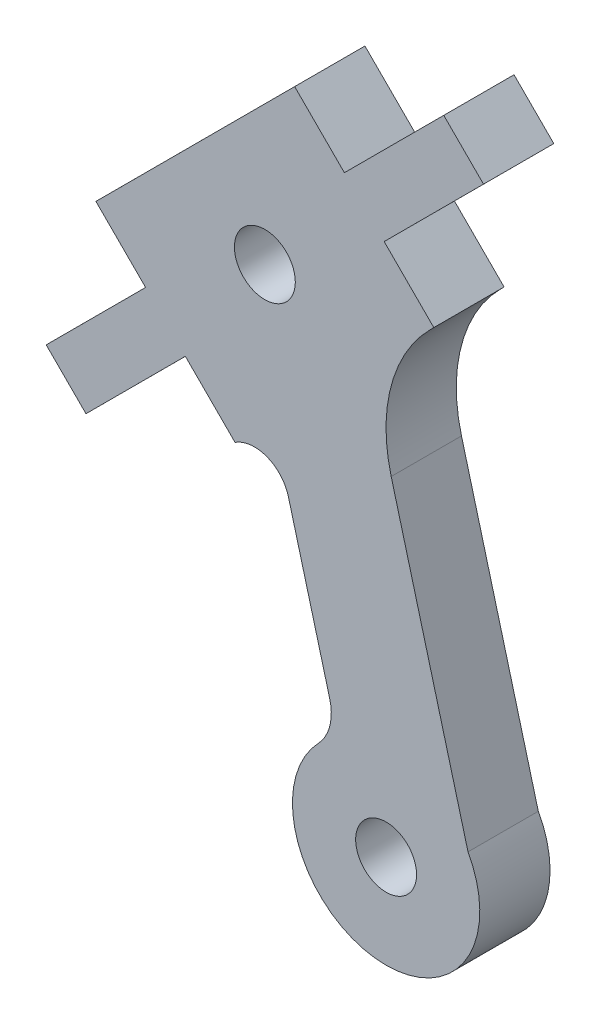
ISO-10303-21;
HEADER;
FILE_DESCRIPTION(('STEP AP214'),'2;1');
FILE_NAME('part.step','',(''),(''),'','','');
FILE_SCHEMA(('AUTOMOTIVE_DESIGN { 1 0 10303 214 1 1 1 1 }'));
ENDSEC;
DATA;
#1=APPLICATION_CONTEXT('core data for automotive mechanical design processes');
#2=APPLICATION_PROTOCOL_DEFINITION('international standard','automotive_design',2000,#1);
#3=PRODUCT_CONTEXT('',#1,'mechanical');
#4=PRODUCT('Part','Part','',(#3));
#5=PRODUCT_RELATED_PRODUCT_CATEGORY('part','',(#4));
#6=PRODUCT_DEFINITION_FORMATION('','',#4);
#7=PRODUCT_DEFINITION_CONTEXT('part definition',#1,'design');
#8=PRODUCT_DEFINITION('design','',#6,#7);
#9=PRODUCT_DEFINITION_SHAPE('','',#8);
#10=(LENGTH_UNIT() NAMED_UNIT(*) SI_UNIT(.MILLI.,.METRE.));
#11=(NAMED_UNIT(*) PLANE_ANGLE_UNIT() SI_UNIT($,.RADIAN.));
#12=(NAMED_UNIT(*) SI_UNIT($,.STERADIAN.) SOLID_ANGLE_UNIT());
#13=UNCERTAINTY_MEASURE_WITH_UNIT(LENGTH_MEASURE(1.E-05),#10,'distance_accuracy_value','');
#14=(GEOMETRIC_REPRESENTATION_CONTEXT(3) GLOBAL_UNCERTAINTY_ASSIGNED_CONTEXT((#13)) GLOBAL_UNIT_ASSIGNED_CONTEXT((#10,
#11,#12)) REPRESENTATION_CONTEXT('',''));
#15=CARTESIAN_POINT('',(0.,0.,0.));
#16=DIRECTION('',(0.,0.,1.));
#17=DIRECTION('',(1.,0.,0.));
#18=AXIS2_PLACEMENT_3D('',#15,#16,#17);
#19=CARTESIAN_POINT('',(15.2079500627444,19.1357173483696,-0.362857667475149));
#20=DIRECTION('',(0.,0.,-1.));
#21=DIRECTION('',(-1.,0.,0.));
#22=AXIS2_PLACEMENT_3D('',#19,#20,#21);
#23=CYLINDRICAL_SURFACE('',#22,6.50000000000002);
#24=CARTESIAN_POINT('',(15.2079500627444,19.1357173483696,-3.36285766747514));
#25=DIRECTION('',(0.,0.,1.));
#26=DIRECTION('',(1.,0.,0.));
#27=AXIS2_PLACEMENT_3D('',#24,#25,#26);
#28=CIRCLE('',#27,6.50000000000002);
#29=CARTESIAN_POINT('',(10.61109831095,23.7312536578797,-3.36285766747514));
#30=VERTEX_POINT('',#29);
#31=CARTESIAN_POINT('',(8.92945698730216,17.4533010201012,-3.36285766747514));
#32=VERTEX_POINT('',#31);
#33=EDGE_CURVE('E194',#30,#32,#28,.T.);
#34=ORIENTED_EDGE('',*,*,#33,.F.);
#35=DIRECTION('',(0.,0.,-1.));
#36=VECTOR('',#35,1.);
#37=CARTESIAN_POINT('',(10.61109831095,23.7312536578797,-0.362857667475149));
#38=LINE('',#37,#36);
#39=CARTESIAN_POINT('',(10.61109831095,23.7312536578797,-0.362857667475149));
#40=VERTEX_POINT('',#39);
#41=EDGE_CURVE('E11',#40,#30,#38,.T.);
#42=ORIENTED_EDGE('',*,*,#41,.F.);
#43=CARTESIAN_POINT('',(15.2079500627444,19.1357173483696,-0.362857667475149));
#44=DIRECTION('',(0.,0.,1.));
#45=DIRECTION('',(1.,0.,0.));
#46=AXIS2_PLACEMENT_3D('',#43,#44,#45);
#47=CIRCLE('',#46,6.50000000000002);
#48=CARTESIAN_POINT('',(8.92945698730216,17.4533010201012,-0.362857667475149));
#49=VERTEX_POINT('',#48);
#50=EDGE_CURVE('E245',#40,#49,#47,.T.);
#51=ORIENTED_EDGE('',*,*,#50,.T.);
#52=DIRECTION('',(0.,0.,-1.));
#53=VECTOR('',#52,1.);
#54=CARTESIAN_POINT('',(8.92945698730216,17.4533010201012,-0.362857667475149));
#55=LINE('',#54,#53);
#56=EDGE_CURVE('E40',#49,#32,#55,.T.);
#57=ORIENTED_EDGE('',*,*,#56,.T.);
#58=EDGE_LOOP('',(#34,#42,#51,#57));
#59=FACE_BOUND('',#58,.T.);
#60=ADVANCED_FACE('F37',(#59),#23,.F.);
#61=CARTESIAN_POINT('',(10.7490725950828,23.8692674362511,-0.362857667475149));
#62=DIRECTION('',(0.707207961814524,-0.70700558607846,0.));
#63=DIRECTION('',(0.70700558607846,0.707207961814524,0.));
#64=AXIS2_PLACEMENT_3D('',#61,#62,#63);
#65=PLANE('',#64);
#66=DIRECTION('',(-0.70700558607846,-0.707207961814524,0.));
#67=VECTOR('',#66,1.);
#68=CARTESIAN_POINT('',(10.7490725950828,23.8692674362511,-3.36285766747514));
#69=LINE('',#68,#67);
#70=CARTESIAN_POINT('',(10.7490725950828,23.8692674362511,-3.36285766747514));
#71=VERTEX_POINT('',#70);
#72=EDGE_CURVE('E243',#71,#30,#69,.T.);
#73=ORIENTED_EDGE('',*,*,#72,.F.);
#74=DIRECTION('',(0.,0.,-1.));
#75=VECTOR('',#74,1.);
#76=CARTESIAN_POINT('',(10.7490725950828,23.8692674362511,-0.362857667475149));
#77=LINE('',#76,#75);
#78=CARTESIAN_POINT('',(10.7490725950828,23.8692674362511,-0.362857667475149));
#79=VERTEX_POINT('',#78);
#80=EDGE_CURVE('E46',#79,#71,#77,.T.);
#81=ORIENTED_EDGE('',*,*,#80,.F.);
#82=DIRECTION('',(-0.70700558607846,-0.707207961814524,0.));
#83=VECTOR('',#82,1.);
#84=CARTESIAN_POINT('',(10.7490725950828,23.8692674362511,-0.362857667475149));
#85=LINE('',#84,#83);
#86=EDGE_CURVE('E184',#79,#40,#85,.T.);
#87=ORIENTED_EDGE('',*,*,#86,.T.);
#88=ORIENTED_EDGE('',*,*,#41,.T.);
#89=EDGE_LOOP('',(#73,#81,#87,#88));
#90=FACE_BOUND('',#89,.T.);
#91=ADVANCED_FACE('F277',(#90),#65,.T.);
#92=CARTESIAN_POINT('',(8.62908040068236,25.9886529703706,-0.362857667475149));
#93=DIRECTION('',(0.70700558607846,0.707207961814524,0.));
#94=DIRECTION('',(-0.707207961814524,0.70700558607846,0.));
#95=AXIS2_PLACEMENT_3D('',#92,#93,#94);
#96=PLANE('',#95);
#97=DIRECTION('',(0.707207961814524,-0.70700558607846,0.));
#98=VECTOR('',#97,1.);
#99=CARTESIAN_POINT('',(8.62908040068236,25.9886529703706,-3.36285766747514));
#100=LINE('',#99,#98);
#101=CARTESIAN_POINT('',(8.62908040068236,25.9886529703706,-3.36285766747514));
#102=VERTEX_POINT('',#101);
#103=EDGE_CURVE('E171',#102,#71,#100,.T.);
#104=ORIENTED_EDGE('',*,*,#103,.F.);
#105=DIRECTION('',(0.,0.,-1.));
#106=VECTOR('',#105,1.);
#107=CARTESIAN_POINT('',(8.62908040068236,25.9886529703706,-0.362857667475149));
#108=LINE('',#107,#106);
#109=CARTESIAN_POINT('',(8.62908040068236,25.9886529703706,-0.362857667475149));
#110=VERTEX_POINT('',#109);
#111=EDGE_CURVE('E166',#110,#102,#108,.T.);
#112=ORIENTED_EDGE('',*,*,#111,.F.);
#113=DIRECTION('',(0.707207961814524,-0.70700558607846,0.));
#114=VECTOR('',#113,1.);
#115=CARTESIAN_POINT('',(8.62908040068236,25.9886529703706,-0.362857667475149));
#116=LINE('',#115,#114);
#117=EDGE_CURVE('E169',#110,#79,#116,.T.);
#118=ORIENTED_EDGE('',*,*,#117,.T.);
#119=ORIENTED_EDGE('',*,*,#80,.T.);
#120=EDGE_LOOP('',(#104,#112,#118,#119));
#121=FACE_BOUND('',#120,.T.);
#122=ADVANCED_FACE('F168',(#121),#96,.T.);
#123=CARTESIAN_POINT('',(12.8704287908276,30.2312154188193,-0.362857667475149));
#124=DIRECTION('',(0.707207961814524,-0.70700558607846,0.));
#125=DIRECTION('',(0.70700558607846,0.707207961814524,0.));
#126=AXIS2_PLACEMENT_3D('',#123,#124,#125);
#127=PLANE('',#126);
#128=DIRECTION('',(-0.70700558607846,-0.707207961814524,0.));
#129=VECTOR('',#128,1.);
#130=CARTESIAN_POINT('',(12.8704287908276,30.2312154188193,-3.36285766747514));
#131=LINE('',#130,#129);
#132=CARTESIAN_POINT('',(12.8704287908276,30.2312154188193,-3.36285766747514));
#133=VERTEX_POINT('',#132);
#134=EDGE_CURVE('E240',#133,#102,#131,.T.);
#135=ORIENTED_EDGE('',*,*,#134,.F.);
#136=DIRECTION('',(0.,0.,-1.));
#137=VECTOR('',#136,1.);
#138=CARTESIAN_POINT('',(12.8704287908276,30.2312154188193,-0.362857667475149));
#139=LINE('',#138,#137);
#140=CARTESIAN_POINT('',(12.8704287908276,30.2312154188193,-0.362857667475149));
#141=VERTEX_POINT('',#140);
#142=EDGE_CURVE('E176',#141,#133,#139,.T.);
#143=ORIENTED_EDGE('',*,*,#142,.F.);
#144=DIRECTION('',(-0.70700558607846,-0.707207961814524,0.));
#145=VECTOR('',#144,1.);
#146=CARTESIAN_POINT('',(12.8704287908276,30.2312154188193,-0.362857667475149));
#147=LINE('',#146,#145);
#148=EDGE_CURVE('E182',#141,#110,#147,.T.);
#149=ORIENTED_EDGE('',*,*,#148,.T.);
#150=ORIENTED_EDGE('',*,*,#111,.T.);
#151=EDGE_LOOP('',(#135,#143,#149,#150));
#152=FACE_BOUND('',#151,.T.);
#153=ADVANCED_FACE('F186',(#152),#127,.T.);
#154=CARTESIAN_POINT('',(11.1732462274371,31.927912313794,-0.362857667475149));
#155=DIRECTION('',(0.707005586078461,0.707207961814523,0.));
#156=DIRECTION('',(-0.707207961814523,0.707005586078461,0.));
#157=AXIS2_PLACEMENT_3D('',#154,#155,#156);
#158=PLANE('',#157);
#159=DIRECTION('',(0.707207961814523,-0.707005586078461,0.));
#160=VECTOR('',#159,1.);
#161=CARTESIAN_POINT('',(11.1732462274371,31.927912313794,-3.36285766747514));
#162=LINE('',#161,#160);
#163=CARTESIAN_POINT('',(11.1732462274371,31.927912313794,-3.36285766747514));
#164=VERTEX_POINT('',#163);
#165=EDGE_CURVE('E237',#164,#133,#162,.T.);
#166=ORIENTED_EDGE('',*,*,#165,.F.);
#167=DIRECTION('',(0.,0.,-1.));
#168=VECTOR('',#167,1.);
#169=CARTESIAN_POINT('',(11.1732462274371,31.927912313794,-0.362857667475149));
#170=LINE('',#169,#168);
#171=CARTESIAN_POINT('',(11.1732462274371,31.927912313794,-0.362857667475149));
#172=VERTEX_POINT('',#171);
#173=EDGE_CURVE('E249',#172,#164,#170,.T.);
#174=ORIENTED_EDGE('',*,*,#173,.F.);
#175=DIRECTION('',(0.707207961814523,-0.707005586078461,0.));
#176=VECTOR('',#175,1.);
#177=CARTESIAN_POINT('',(11.1732462274371,31.927912313794,-0.362857667475149));
#178=LINE('',#177,#176);
#179=EDGE_CURVE('E187',#172,#141,#178,.T.);
#180=ORIENTED_EDGE('',*,*,#179,.T.);
#181=ORIENTED_EDGE('',*,*,#142,.T.);
#182=EDGE_LOOP('',(#166,#174,#180,#181));
#183=FACE_BOUND('',#182,.T.);
#184=ADVANCED_FACE('F290',(#183),#158,.T.);
#185=CARTESIAN_POINT('',(6.93196836559366,27.6854204138355,-0.362857667475149));
#186=DIRECTION('',(-0.707207961814524,0.70700558607846,0.));
#187=DIRECTION('',(-0.70700558607846,-0.707207961814524,0.));
#188=AXIS2_PLACEMENT_3D('',#185,#186,#187);
#189=PLANE('',#188);
#190=DIRECTION('',(0.70700558607846,0.707207961814524,0.));
#191=VECTOR('',#190,1.);
#192=CARTESIAN_POINT('',(6.93196836559366,27.6854204138355,-3.36285766747514));
#193=LINE('',#192,#191);
#194=CARTESIAN_POINT('',(6.93196836559366,27.6854204138355,-3.36285766747514));
#195=VERTEX_POINT('',#194);
#196=EDGE_CURVE('E234',#195,#164,#193,.T.);
#197=ORIENTED_EDGE('',*,*,#196,.F.);
#198=DIRECTION('',(0.,0.,-1.));
#199=VECTOR('',#198,1.);
#200=CARTESIAN_POINT('',(6.93196836559366,27.6854204138355,-0.362857667475149));
#201=LINE('',#200,#199);
#202=CARTESIAN_POINT('',(6.93196836559366,27.6854204138355,-0.362857667475149));
#203=VERTEX_POINT('',#202);
#204=EDGE_CURVE('E251',#203,#195,#201,.T.);
#205=ORIENTED_EDGE('',*,*,#204,.F.);
#206=DIRECTION('',(0.70700558607846,0.707207961814524,0.));
#207=VECTOR('',#206,1.);
#208=CARTESIAN_POINT('',(6.93196836559366,27.6854204138355,-0.362857667475149));
#209=LINE('',#208,#207);
#210=EDGE_CURVE('E189',#203,#172,#209,.T.);
#211=ORIENTED_EDGE('',*,*,#210,.T.);
#212=ORIENTED_EDGE('',*,*,#173,.T.);
#213=EDGE_LOOP('',(#197,#205,#211,#212));
#214=FACE_BOUND('',#213,.T.);
#215=ADVANCED_FACE('F293',(#214),#189,.T.);
#216=CARTESIAN_POINT('',(4.80844312338461,29.8083379847411,-0.362857667475149));
#217=DIRECTION('',(0.70700558607846,0.707207961814524,0.));
#218=DIRECTION('',(-0.707207961814524,0.70700558607846,0.));
#219=AXIS2_PLACEMENT_3D('',#216,#217,#218);
#220=PLANE('',#219);
#221=DIRECTION('',(0.707207961814524,-0.70700558607846,0.));
#222=VECTOR('',#221,1.);
#223=CARTESIAN_POINT('',(4.80844312338461,29.8083379847411,-3.36285766747514));
#224=LINE('',#223,#222);
#225=CARTESIAN_POINT('',(4.80844312338461,29.8083379847411,-3.36285766747514));
#226=VERTEX_POINT('',#225);
#227=EDGE_CURVE('E231',#226,#195,#224,.T.);
#228=ORIENTED_EDGE('',*,*,#227,.F.);
#229=DIRECTION('',(0.,0.,-1.));
#230=VECTOR('',#229,1.);
#231=CARTESIAN_POINT('',(4.80844312338461,29.8083379847411,-0.362857667475149));
#232=LINE('',#231,#230);
#233=CARTESIAN_POINT('',(4.80844312338461,29.8083379847411,-0.362857667475149));
#234=VERTEX_POINT('',#233);
#235=EDGE_CURVE('E253',#234,#226,#232,.T.);
#236=ORIENTED_EDGE('',*,*,#235,.F.);
#237=DIRECTION('',(0.707207961814524,-0.70700558607846,0.));
#238=VECTOR('',#237,1.);
#239=CARTESIAN_POINT('',(4.80844312338461,29.8083379847411,-0.362857667475149));
#240=LINE('',#239,#238);
#241=EDGE_CURVE('E409',#234,#203,#240,.T.);
#242=ORIENTED_EDGE('',*,*,#241,.T.);
#243=ORIENTED_EDGE('',*,*,#204,.T.);
#244=EDGE_LOOP('',(#228,#236,#242,#243));
#245=FACE_BOUND('',#244,.T.);
#246=ADVANCED_FACE('F297',(#245),#220,.T.);
#247=CARTESIAN_POINT('',(-3.67577876488751,21.3216875433099,-0.362857667475149));
#248=DIRECTION('',(-0.707207961814524,0.70700558607846,0.));
#249=DIRECTION('',(-0.70700558607846,-0.707207961814524,0.));
#250=AXIS2_PLACEMENT_3D('',#247,#248,#249);
#251=PLANE('',#250);
#252=DIRECTION('',(0.70700558607846,0.707207961814524,0.));
#253=VECTOR('',#252,1.);
#254=CARTESIAN_POINT('',(-3.67577876488751,21.3216875433099,-3.36285766747514));
#255=LINE('',#254,#253);
#256=CARTESIAN_POINT('',(-3.67577876488751,21.3216875433099,-3.36285766747514));
#257=VERTEX_POINT('',#256);
#258=EDGE_CURVE('E228',#257,#226,#255,.T.);
#259=ORIENTED_EDGE('',*,*,#258,.F.);
#260=DIRECTION('',(0.,0.,-1.));
#261=VECTOR('',#260,1.);
#262=CARTESIAN_POINT('',(-3.67577876488751,21.3216875433099,-0.362857667475149));
#263=LINE('',#262,#261);
#264=CARTESIAN_POINT('',(-3.67577876488751,21.3216875433099,-0.362857667475149));
#265=VERTEX_POINT('',#264);
#266=EDGE_CURVE('E255',#265,#257,#263,.T.);
#267=ORIENTED_EDGE('',*,*,#266,.F.);
#268=DIRECTION('',(0.70700558607846,0.707207961814524,0.));
#269=VECTOR('',#268,1.);
#270=CARTESIAN_POINT('',(-3.67577876488751,21.3216875433099,-0.362857667475149));
#271=LINE('',#270,#269);
#272=EDGE_CURVE('E406',#265,#234,#271,.T.);
#273=ORIENTED_EDGE('',*,*,#272,.T.);
#274=ORIENTED_EDGE('',*,*,#235,.T.);
#275=EDGE_LOOP('',(#259,#267,#273,#274));
#276=FACE_BOUND('',#275,.T.);
#277=ADVANCED_FACE('F301',(#276),#251,.T.);
#278=CARTESIAN_POINT('',(-1.55453239865851,19.2010481962576,-0.362857667475149));
#279=DIRECTION('',(-0.707005586078461,-0.707207961814523,0.));
#280=DIRECTION('',(0.707207961814523,-0.707005586078461,0.));
#281=AXIS2_PLACEMENT_3D('',#278,#279,#280);
#282=PLANE('',#281);
#283=DIRECTION('',(-0.707207961814523,0.707005586078461,0.));
#284=VECTOR('',#283,1.);
#285=CARTESIAN_POINT('',(-1.55453239865851,19.2010481962576,-3.36285766747514));
#286=LINE('',#285,#284);
#287=CARTESIAN_POINT('',(-1.55453239865851,19.2010481962576,-3.36285766747514));
#288=VERTEX_POINT('',#287);
#289=EDGE_CURVE('E225',#288,#257,#286,.T.);
#290=ORIENTED_EDGE('',*,*,#289,.F.);
#291=DIRECTION('',(0.,0.,-1.));
#292=VECTOR('',#291,1.);
#293=CARTESIAN_POINT('',(-1.55453239865851,19.2010481962576,-0.362857667475149));
#294=LINE('',#293,#292);
#295=CARTESIAN_POINT('',(-1.55453239865851,19.2010481962576,-0.362857667475149));
#296=VERTEX_POINT('',#295);
#297=EDGE_CURVE('E257',#296,#288,#294,.T.);
#298=ORIENTED_EDGE('',*,*,#297,.F.);
#299=DIRECTION('',(-0.707207961814523,0.707005586078461,0.));
#300=VECTOR('',#299,1.);
#301=CARTESIAN_POINT('',(-1.55453239865851,19.2010481962576,-0.362857667475149));
#302=LINE('',#301,#300);
#303=EDGE_CURVE('E403',#296,#265,#302,.T.);
#304=ORIENTED_EDGE('',*,*,#303,.T.);
#305=ORIENTED_EDGE('',*,*,#266,.T.);
#306=EDGE_LOOP('',(#290,#298,#304,#305));
#307=FACE_BOUND('',#306,.T.);
#308=ADVANCED_FACE('F305',(#307),#282,.T.);
#309=CARTESIAN_POINT('',(-5.79750925647129,14.9568568140031,-0.362857667475149));
#310=DIRECTION('',(-0.707207961814524,0.70700558607846,0.));
#311=DIRECTION('',(-0.70700558607846,-0.707207961814524,0.));
#312=AXIS2_PLACEMENT_3D('',#309,#310,#311);
#313=PLANE('',#312);
#314=DIRECTION('',(0.70700558607846,0.707207961814524,0.));
#315=VECTOR('',#314,1.);
#316=CARTESIAN_POINT('',(-5.79750925647129,14.9568568140031,-3.36285766747514));
#317=LINE('',#316,#315);
#318=CARTESIAN_POINT('',(-5.79750925647129,14.9568568140031,-3.36285766747514));
#319=VERTEX_POINT('',#318);
#320=EDGE_CURVE('E222',#319,#288,#317,.T.);
#321=ORIENTED_EDGE('',*,*,#320,.F.);
#322=DIRECTION('',(0.,0.,-1.));
#323=VECTOR('',#322,1.);
#324=CARTESIAN_POINT('',(-5.79750925647129,14.9568568140031,-0.362857667475149));
#325=LINE('',#324,#323);
#326=CARTESIAN_POINT('',(-5.79750925647129,14.9568568140031,-0.362857667475149));
#327=VERTEX_POINT('',#326);
#328=EDGE_CURVE('E259',#327,#319,#325,.T.);
#329=ORIENTED_EDGE('',*,*,#328,.F.);
#330=DIRECTION('',(0.70700558607846,0.707207961814524,0.));
#331=VECTOR('',#330,1.);
#332=CARTESIAN_POINT('',(-5.79750925647129,14.9568568140031,-0.362857667475149));
#333=LINE('',#332,#331);
#334=EDGE_CURVE('E400',#327,#296,#333,.T.);
#335=ORIENTED_EDGE('',*,*,#334,.T.);
#336=ORIENTED_EDGE('',*,*,#297,.T.);
#337=EDGE_LOOP('',(#321,#329,#335,#336));
#338=FACE_BOUND('',#337,.T.);
#339=ADVANCED_FACE('F309',(#338),#313,.T.);
#340=CARTESIAN_POINT('',(-4.09981959931593,13.2596529703744,-0.362857667475149));
#341=DIRECTION('',(-0.70700558607846,-0.707207961814524,0.));
#342=DIRECTION('',(0.707207961814524,-0.70700558607846,0.));
#343=AXIS2_PLACEMENT_3D('',#340,#341,#342);
#344=PLANE('',#343);
#345=DIRECTION('',(-0.707207961814524,0.70700558607846,0.));
#346=VECTOR('',#345,1.);
#347=CARTESIAN_POINT('',(-4.09981959931593,13.2596529703744,-3.36285766747514));
#348=LINE('',#347,#346);
#349=CARTESIAN_POINT('',(-4.09981959931593,13.2596529703744,-3.36285766747514));
#350=VERTEX_POINT('',#349);
#351=EDGE_CURVE('E219',#350,#319,#348,.T.);
#352=ORIENTED_EDGE('',*,*,#351,.F.);
#353=DIRECTION('',(0.,0.,-1.));
#354=VECTOR('',#353,1.);
#355=CARTESIAN_POINT('',(-4.09981959931593,13.2596529703744,-0.362857667475149));
#356=LINE('',#355,#354);
#357=CARTESIAN_POINT('',(-4.09981959931593,13.2596529703744,-0.362857667475149));
#358=VERTEX_POINT('',#357);
#359=EDGE_CURVE('E261',#358,#350,#356,.T.);
#360=ORIENTED_EDGE('',*,*,#359,.F.);
#361=DIRECTION('',(-0.707207961814524,0.70700558607846,0.));
#362=VECTOR('',#361,1.);
#363=CARTESIAN_POINT('',(-4.09981959931593,13.2596529703744,-0.362857667475149));
#364=LINE('',#363,#362);
#365=EDGE_CURVE('E397',#358,#327,#364,.T.);
#366=ORIENTED_EDGE('',*,*,#365,.T.);
#367=ORIENTED_EDGE('',*,*,#328,.T.);
#368=EDGE_LOOP('',(#352,#360,#366,#367));
#369=FACE_BOUND('',#368,.T.);
#370=ADVANCED_FACE('F313',(#369),#344,.T.);
#371=CARTESIAN_POINT('',(0.142530427800659,17.5032173425065,-0.362857667475149));
#372=DIRECTION('',(0.707207961814524,-0.70700558607846,0.));
#373=DIRECTION('',(0.70700558607846,0.707207961814524,0.));
#374=AXIS2_PLACEMENT_3D('',#371,#372,#373);
#375=PLANE('',#374);
#376=DIRECTION('',(-0.70700558607846,-0.707207961814524,0.));
#377=VECTOR('',#376,1.);
#378=CARTESIAN_POINT('',(0.142530427800659,17.5032173425065,-3.36285766747514));
#379=LINE('',#378,#377);
#380=CARTESIAN_POINT('',(0.142530427800659,17.5032173425065,-3.36285766747514));
#381=VERTEX_POINT('',#380);
#382=EDGE_CURVE('E216',#381,#350,#379,.T.);
#383=ORIENTED_EDGE('',*,*,#382,.F.);
#384=DIRECTION('',(0.,0.,-1.));
#385=VECTOR('',#384,1.);
#386=CARTESIAN_POINT('',(0.142530427800659,17.5032173425065,-0.362857667475149));
#387=LINE('',#386,#385);
#388=CARTESIAN_POINT('',(0.142530427800659,17.5032173425065,-0.362857667475149));
#389=VERTEX_POINT('',#388);
#390=EDGE_CURVE('E263',#389,#381,#387,.T.);
#391=ORIENTED_EDGE('',*,*,#390,.F.);
#392=DIRECTION('',(-0.70700558607846,-0.707207961814524,0.));
#393=VECTOR('',#392,1.);
#394=CARTESIAN_POINT('',(0.142530427800659,17.5032173425065,-0.362857667475149));
#395=LINE('',#394,#393);
#396=EDGE_CURVE('E394',#389,#358,#395,.T.);
#397=ORIENTED_EDGE('',*,*,#396,.T.);
#398=ORIENTED_EDGE('',*,*,#359,.T.);
#399=EDGE_LOOP('',(#383,#391,#397,#398));
#400=FACE_BOUND('',#399,.T.);
#401=ADVANCED_FACE('F317',(#400),#375,.T.);
#402=CARTESIAN_POINT('',(2.26429440442013,15.3820605331839,-0.362857667475149));
#403=DIRECTION('',(-0.707005586078461,-0.707207961814523,0.));
#404=DIRECTION('',(0.707207961814523,-0.707005586078461,0.));
#405=AXIS2_PLACEMENT_3D('',#402,#403,#404);
#406=PLANE('',#405);
#407=DIRECTION('',(-0.707207961814523,0.707005586078461,0.));
#408=VECTOR('',#407,1.);
#409=CARTESIAN_POINT('',(2.26429440442013,15.3820605331839,-3.36285766747514));
#410=LINE('',#409,#408);
#411=CARTESIAN_POINT('',(2.26429440442013,15.3820605331839,-3.36285766747514));
#412=VERTEX_POINT('',#411);
#413=EDGE_CURVE('E213',#412,#381,#410,.T.);
#414=ORIENTED_EDGE('',*,*,#413,.F.);
#415=DIRECTION('',(0.,0.,-1.));
#416=VECTOR('',#415,1.);
#417=CARTESIAN_POINT('',(2.26429440442013,15.3820605331839,-0.362857667475149));
#418=LINE('',#417,#416);
#419=CARTESIAN_POINT('',(2.26429440442013,15.3820605331839,-0.362857667475149));
#420=VERTEX_POINT('',#419);
#421=EDGE_CURVE('E265',#420,#412,#418,.T.);
#422=ORIENTED_EDGE('',*,*,#421,.F.);
#423=DIRECTION('',(-0.707207961814523,0.707005586078461,0.));
#424=VECTOR('',#423,1.);
#425=CARTESIAN_POINT('',(2.26429440442013,15.3820605331839,-0.362857667475149));
#426=LINE('',#425,#424);
#427=EDGE_CURVE('E391',#420,#389,#426,.T.);
#428=ORIENTED_EDGE('',*,*,#427,.T.);
#429=ORIENTED_EDGE('',*,*,#390,.T.);
#430=EDGE_LOOP('',(#414,#422,#428,#429));
#431=FACE_BOUND('',#430,.T.);
#432=ADVANCED_FACE('F321',(#431),#406,.T.);
#433=CARTESIAN_POINT('',(3.09080137362647,14.1303072708183,-0.362857667475149));
#434=DIRECTION('',(0.,0.,-1.));
#435=DIRECTION('',(-1.,0.,0.));
#436=AXIS2_PLACEMENT_3D('',#433,#434,#435);
#437=CYLINDRICAL_SURFACE('',#436,1.4999999999965);
#438=CARTESIAN_POINT('',(3.09080137362647,14.1303072708183,-3.36285766747514));
#439=DIRECTION('',(0.,0.,1.));
#440=DIRECTION('',(1.,0.,0.));
#441=AXIS2_PLACEMENT_3D('',#438,#439,#440);
#442=CIRCLE('',#441,1.4999999999965);
#443=CARTESIAN_POINT('',(4.53968439103283,14.5185571927255,-3.36285766747514));
#444=VERTEX_POINT('',#443);
#445=EDGE_CURVE('E210',#444,#412,#442,.T.);
#446=ORIENTED_EDGE('',*,*,#445,.F.);
#447=DIRECTION('',(0.,0.,-1.));
#448=VECTOR('',#447,1.);
#449=CARTESIAN_POINT('',(4.53968439103283,14.5185571927255,-0.362857667475149));
#450=LINE('',#449,#448);
#451=CARTESIAN_POINT('',(4.53968439103283,14.5185571927255,-0.362857667475149));
#452=VERTEX_POINT('',#451);
#453=EDGE_CURVE('E267',#452,#444,#450,.T.);
#454=ORIENTED_EDGE('',*,*,#453,.F.);
#455=CARTESIAN_POINT('',(3.09080137362647,14.1303072708183,-0.362857667475149));
#456=DIRECTION('',(0.,0.,1.));
#457=DIRECTION('',(1.,0.,0.));
#458=AXIS2_PLACEMENT_3D('',#455,#456,#457);
#459=CIRCLE('',#458,1.4999999999965);
#460=EDGE_CURVE('E388',#452,#420,#459,.T.);
#461=ORIENTED_EDGE('',*,*,#460,.T.);
#462=ORIENTED_EDGE('',*,*,#421,.T.);
#463=EDGE_LOOP('',(#446,#454,#461,#462));
#464=FACE_BOUND('',#463,.T.);
#465=ADVANCED_FACE('F325',(#464),#437,.F.);
#466=CARTESIAN_POINT('',(6.30415992830698,7.93383303353641,-0.362857667475149));
#467=DIRECTION('',(-0.965922011606496,-0.258833281272058,0.));
#468=DIRECTION('',(0.258833281272058,-0.965922011606496,0.));
#469=AXIS2_PLACEMENT_3D('',#466,#467,#468);
#470=PLANE('',#469);
#471=DIRECTION('',(-0.258833281272058,0.965922011606496,0.));
#472=VECTOR('',#471,1.);
#473=CARTESIAN_POINT('',(6.30415992830698,7.93383303353641,-3.36285766747514));
#474=LINE('',#473,#472);
#475=CARTESIAN_POINT('',(6.30415992830698,7.93383303353641,-3.36285766747514));
#476=VERTEX_POINT('',#475);
#477=EDGE_CURVE('E207',#476,#444,#474,.T.);
#478=ORIENTED_EDGE('',*,*,#477,.F.);
#479=DIRECTION('',(0.,0.,-1.));
#480=VECTOR('',#479,1.);
#481=CARTESIAN_POINT('',(6.30415992830698,7.93383303353641,-0.362857667475149));
#482=LINE('',#481,#480);
#483=CARTESIAN_POINT('',(6.30415992830698,7.93383303353641,-0.362857667475149));
#484=VERTEX_POINT('',#483);
#485=EDGE_CURVE('E269',#484,#476,#482,.T.);
#486=ORIENTED_EDGE('',*,*,#485,.F.);
#487=DIRECTION('',(-0.258833281272058,0.965922011606496,0.));
#488=VECTOR('',#487,1.);
#489=CARTESIAN_POINT('',(6.30415992830698,7.93383303353641,-0.362857667475149));
#490=LINE('',#489,#488);
#491=EDGE_CURVE('E385',#484,#452,#490,.T.);
#492=ORIENTED_EDGE('',*,*,#491,.T.);
#493=ORIENTED_EDGE('',*,*,#453,.T.);
#494=EDGE_LOOP('',(#478,#486,#492,#493));
#495=FACE_BOUND('',#494,.T.);
#496=ADVANCED_FACE('F329',(#495),#470,.T.);
#497=CARTESIAN_POINT('',(4.37231590509399,7.41616647099229,-0.362857667475149));
#498=DIRECTION('',(0.,0.,-1.));
#499=DIRECTION('',(-1.,0.,0.));
#500=AXIS2_PLACEMENT_3D('',#497,#498,#499);
#501=CYLINDRICAL_SURFACE('',#500,2.);
#502=CARTESIAN_POINT('',(4.37231590509399,7.41616647099229,-3.36285766747514));
#503=DIRECTION('',(0.,0.,1.));
#504=DIRECTION('',(1.,0.,0.));
#505=AXIS2_PLACEMENT_3D('',#502,#503,#504);
#506=CIRCLE('',#505,2.);
#507=CARTESIAN_POINT('',(5.81930803297835,6.03550946005848,-3.36285766747514));
#508=VERTEX_POINT('',#507);
#509=EDGE_CURVE('E204',#508,#476,#506,.T.);
#510=ORIENTED_EDGE('',*,*,#509,.F.);
#511=DIRECTION('',(0.,0.,-1.));
#512=VECTOR('',#511,1.);
#513=CARTESIAN_POINT('',(5.81930803297835,6.03550946005848,-0.362857667475149));
#514=LINE('',#513,#512);
#515=CARTESIAN_POINT('',(5.81930803297835,6.03550946005848,-0.362857667475149));
#516=VERTEX_POINT('',#515);
#517=EDGE_CURVE('E271',#516,#508,#514,.T.);
#518=ORIENTED_EDGE('',*,*,#517,.F.);
#519=CARTESIAN_POINT('',(4.37231590509399,7.41616647099229,-0.362857667475149));
#520=DIRECTION('',(0.,0.,1.));
#521=DIRECTION('',(1.,0.,0.));
#522=AXIS2_PLACEMENT_3D('',#519,#520,#521);
#523=CIRCLE('',#522,2.);
#524=EDGE_CURVE('E382',#516,#484,#523,.T.);
#525=ORIENTED_EDGE('',*,*,#524,.T.);
#526=ORIENTED_EDGE('',*,*,#485,.T.);
#527=EDGE_LOOP('',(#510,#518,#525,#526));
#528=FACE_BOUND('',#527,.T.);
#529=ADVANCED_FACE('F333',(#528),#501,.F.);
#530=CARTESIAN_POINT('',(8.71249984000659,3.27495155834402,-0.362857667475149));
#531=DIRECTION('',(0.,0.,-1.));
#532=DIRECTION('',(-1.,0.,0.));
#533=AXIS2_PLACEMENT_3D('',#530,#531,#532);
#534=CYLINDRICAL_SURFACE('',#533,3.99890469516009);
#535=CARTESIAN_POINT('',(8.71249984000659,3.27495155834402,-3.36285766747514));
#536=DIRECTION('',(0.,0.,-1.));
#537=DIRECTION('',(-1.,0.,0.));
#538=AXIS2_PLACEMENT_3D('',#535,#536,#537);
#539=CIRCLE('',#538,3.99890469516009);
#540=CARTESIAN_POINT('',(12.2085349080119,5.21633703378425,-3.36285766747514));
#541=VERTEX_POINT('',#540);
#542=EDGE_CURVE('E201',#541,#508,#539,.T.);
#543=ORIENTED_EDGE('',*,*,#542,.F.);
#544=DIRECTION('',(0.,0.,-1.));
#545=VECTOR('',#544,1.);
#546=CARTESIAN_POINT('',(12.2085349080119,5.21633703378425,-0.362857667475149));
#547=LINE('',#546,#545);
#548=CARTESIAN_POINT('',(12.2085349080119,5.21633703378425,-0.362857667475149));
#549=VERTEX_POINT('',#548);
#550=EDGE_CURVE('E272',#549,#541,#547,.T.);
#551=ORIENTED_EDGE('',*,*,#550,.F.);
#552=CARTESIAN_POINT('',(8.71249984000659,3.27495155834402,-0.362857667475149));
#553=DIRECTION('',(0.,0.,-1.));
#554=DIRECTION('',(-1.,0.,0.));
#555=AXIS2_PLACEMENT_3D('',#552,#553,#554);
#556=CIRCLE('',#555,3.99890469516009);
#557=EDGE_CURVE('E379',#549,#516,#556,.T.);
#558=ORIENTED_EDGE('',*,*,#557,.T.);
#559=ORIENTED_EDGE('',*,*,#517,.T.);
#560=EDGE_LOOP('',(#543,#551,#558,#559));
#561=FACE_BOUND('',#560,.T.);
#562=ADVANCED_FACE('F337',(#561),#534,.T.);
#563=CARTESIAN_POINT('',(8.92945698730216,17.4533010201012,-0.362857667475149));
#564=DIRECTION('',(0.965922011606496,0.258833281272059,0.));
#565=DIRECTION('',(-0.258833281272059,0.965922011606496,0.));
#566=AXIS2_PLACEMENT_3D('',#563,#564,#565);
#567=PLANE('',#566);
#568=DIRECTION('',(0.258833281272059,-0.965922011606496,0.));
#569=VECTOR('',#568,1.);
#570=CARTESIAN_POINT('',(8.92945698730216,17.4533010201012,-3.36285766747514));
#571=LINE('',#570,#569);
#572=EDGE_CURVE('E197',#32,#541,#571,.T.);
#573=ORIENTED_EDGE('',*,*,#572,.F.);
#574=ORIENTED_EDGE('',*,*,#56,.F.);
#575=DIRECTION('',(0.258833281272059,-0.965922011606496,0.));
#576=VECTOR('',#575,1.);
#577=CARTESIAN_POINT('',(8.92945698730216,17.4533010201012,-0.362857667475149));
#578=LINE('',#577,#576);
#579=EDGE_CURVE('E377',#49,#549,#578,.T.);
#580=ORIENTED_EDGE('',*,*,#579,.T.);
#581=ORIENTED_EDGE('',*,*,#550,.T.);
#582=EDGE_LOOP('',(#573,#574,#580,#581));
#583=FACE_BOUND('',#582,.T.);
#584=ADVANCED_FACE('F274',(#583),#567,.T.);
#585=CARTESIAN_POINT('',(15.2079500627444,19.1357173483696,-0.362857667475149));
#586=DIRECTION('',(0.,0.,1.));
#587=DIRECTION('',(1.,0.,0.));
#588=AXIS2_PLACEMENT_3D('',#585,#586,#587);
#589=PLANE('',#588);
#590=CARTESIAN_POINT('',(8.71249984000659,3.27495155834402,-0.362857667475149));
#591=DIRECTION('',(0.,0.,-1.));
#592=DIRECTION('',(1.,0.,0.));
#593=AXIS2_PLACEMENT_3D('',#590,#591,#592);
#594=CIRCLE('',#593,1.3);
#595=CARTESIAN_POINT('',(10.0124998400066,3.27495155834402,-0.362857667475149));
#596=VERTEX_POINT('',#595);
#597=EDGE_CURVE('E364',#596,#596,#594,.T.);
#598=ORIENTED_EDGE('',*,*,#597,.T.);
#599=EDGE_LOOP('',(#598));
#600=FACE_BOUND('',#599,.T.);
#601=CARTESIAN_POINT('',(3.53656757422475,22.5939838241258,-0.362857667475149));
#602=DIRECTION('',(0.,0.,-1.));
#603=DIRECTION('',(1.,0.,0.));
#604=AXIS2_PLACEMENT_3D('',#601,#602,#603);
#605=CIRCLE('',#604,1.3);
#606=CARTESIAN_POINT('',(4.83656757422475,22.5939838241258,-0.362857667475149));
#607=VERTEX_POINT('',#606);
#608=EDGE_CURVE('E198',#607,#607,#605,.T.);
#609=ORIENTED_EDGE('',*,*,#608,.T.);
#610=EDGE_LOOP('',(#609));
#611=FACE_BOUND('',#610,.T.);
#612=ORIENTED_EDGE('',*,*,#50,.F.);
#613=ORIENTED_EDGE('',*,*,#86,.F.);
#614=ORIENTED_EDGE('',*,*,#117,.F.);
#615=ORIENTED_EDGE('',*,*,#148,.F.);
#616=ORIENTED_EDGE('',*,*,#179,.F.);
#617=ORIENTED_EDGE('',*,*,#210,.F.);
#618=ORIENTED_EDGE('',*,*,#241,.F.);
#619=ORIENTED_EDGE('',*,*,#272,.F.);
#620=ORIENTED_EDGE('',*,*,#303,.F.);
#621=ORIENTED_EDGE('',*,*,#334,.F.);
#622=ORIENTED_EDGE('',*,*,#365,.F.);
#623=ORIENTED_EDGE('',*,*,#396,.F.);
#624=ORIENTED_EDGE('',*,*,#427,.F.);
#625=ORIENTED_EDGE('',*,*,#460,.F.);
#626=ORIENTED_EDGE('',*,*,#491,.F.);
#627=ORIENTED_EDGE('',*,*,#524,.F.);
#628=ORIENTED_EDGE('',*,*,#557,.F.);
#629=ORIENTED_EDGE('',*,*,#579,.F.);
#630=EDGE_LOOP('',(#612,#613,#614,#615,#616,#617,#618,#619,#620,#621,#622,#623,#624,#625,#626,
#627,#628,#629));
#631=FACE_BOUND('',#630,.T.);
#632=ADVANCED_FACE('F180',(#600,#611,#631),#589,.T.);
#633=CARTESIAN_POINT('',(15.2079500627444,19.1357173483696,-3.36285766747514));
#634=DIRECTION('',(0.,0.,1.));
#635=DIRECTION('',(1.,0.,0.));
#636=AXIS2_PLACEMENT_3D('',#633,#634,#635);
#637=PLANE('',#636);
#638=CARTESIAN_POINT('',(8.71249984000659,3.27495155834402,-3.36285766747514));
#639=DIRECTION('',(0.,0.,-1.));
#640=DIRECTION('',(1.,0.,0.));
#641=AXIS2_PLACEMENT_3D('',#638,#639,#640);
#642=CIRCLE('',#641,1.3);
#643=CARTESIAN_POINT('',(10.0124998400066,3.27495155834402,-3.36285766747514));
#644=VERTEX_POINT('',#643);
#645=EDGE_CURVE('E367',#644,#644,#642,.T.);
#646=ORIENTED_EDGE('',*,*,#645,.F.);
#647=EDGE_LOOP('',(#646));
#648=FACE_BOUND('',#647,.T.);
#649=CARTESIAN_POINT('',(3.53656757422475,22.5939838241258,-3.36285766747514));
#650=DIRECTION('',(0.,0.,-1.));
#651=DIRECTION('',(1.,0.,0.));
#652=AXIS2_PLACEMENT_3D('',#649,#650,#651);
#653=CIRCLE('',#652,1.3);
#654=CARTESIAN_POINT('',(4.83656757422475,22.5939838241258,-3.36285766747514));
#655=VERTEX_POINT('',#654);
#656=EDGE_CURVE('E369',#655,#655,#653,.T.);
#657=ORIENTED_EDGE('',*,*,#656,.F.);
#658=EDGE_LOOP('',(#657));
#659=FACE_BOUND('',#658,.T.);
#660=ORIENTED_EDGE('',*,*,#33,.T.);
#661=ORIENTED_EDGE('',*,*,#572,.T.);
#662=ORIENTED_EDGE('',*,*,#542,.T.);
#663=ORIENTED_EDGE('',*,*,#509,.T.);
#664=ORIENTED_EDGE('',*,*,#477,.T.);
#665=ORIENTED_EDGE('',*,*,#445,.T.);
#666=ORIENTED_EDGE('',*,*,#413,.T.);
#667=ORIENTED_EDGE('',*,*,#382,.T.);
#668=ORIENTED_EDGE('',*,*,#351,.T.);
#669=ORIENTED_EDGE('',*,*,#320,.T.);
#670=ORIENTED_EDGE('',*,*,#289,.T.);
#671=ORIENTED_EDGE('',*,*,#258,.T.);
#672=ORIENTED_EDGE('',*,*,#227,.T.);
#673=ORIENTED_EDGE('',*,*,#196,.T.);
#674=ORIENTED_EDGE('',*,*,#165,.T.);
#675=ORIENTED_EDGE('',*,*,#134,.T.);
#676=ORIENTED_EDGE('',*,*,#103,.T.);
#677=ORIENTED_EDGE('',*,*,#72,.T.);
#678=EDGE_LOOP('',(#660,#661,#662,#663,#664,#665,#666,#667,#668,#669,#670,#671,#672,#673,#674,
#675,#676,#677));
#679=FACE_BOUND('',#678,.T.);
#680=ADVANCED_FACE('F276',(#648,#659,#679),#637,.F.);
#681=CARTESIAN_POINT('',(3.53656757422475,22.5939838241258,-0.362857667475149));
#682=DIRECTION('',(0.,0.,-1.));
#683=DIRECTION('',(-1.,0.,0.));
#684=AXIS2_PLACEMENT_3D('',#681,#682,#683);
#685=CYLINDRICAL_SURFACE('',#684,1.3);
#686=ORIENTED_EDGE('',*,*,#608,.F.);
#687=EDGE_LOOP('',(#686));
#688=FACE_BOUND('',#687,.T.);
#689=ORIENTED_EDGE('',*,*,#656,.T.);
#690=EDGE_LOOP('',(#689));
#691=FACE_BOUND('',#690,.T.);
#692=ADVANCED_FACE('F349',(#688,#691),#685,.F.);
#693=CARTESIAN_POINT('',(8.71249984000659,3.27495155834402,-0.362857667475149));
#694=DIRECTION('',(0.,0.,-1.));
#695=DIRECTION('',(-1.,0.,0.));
#696=AXIS2_PLACEMENT_3D('',#693,#694,#695);
#697=CYLINDRICAL_SURFACE('',#696,1.3);
#698=ORIENTED_EDGE('',*,*,#597,.F.);
#699=EDGE_LOOP('',(#698));
#700=FACE_BOUND('',#699,.T.);
#701=ORIENTED_EDGE('',*,*,#645,.T.);
#702=EDGE_LOOP('',(#701));
#703=FACE_BOUND('',#702,.T.);
#704=ADVANCED_FACE('F356',(#700,#703),#697,.F.);
#705=CLOSED_SHELL('',(#60,#91,#122,#153,#184,#215,#246,#277,#308,#339,#370,#401,#432,#465,#496,
#529,#562,#584,#632,#680,#692,#704));
#706=MANIFOLD_SOLID_BREP('B2',#705);
#707=ADVANCED_BREP_SHAPE_REPRESENTATION('',(#18,#706),#14);
#708=SHAPE_DEFINITION_REPRESENTATION(#9,#707);
ENDSEC;
END-ISO-10303-21;
